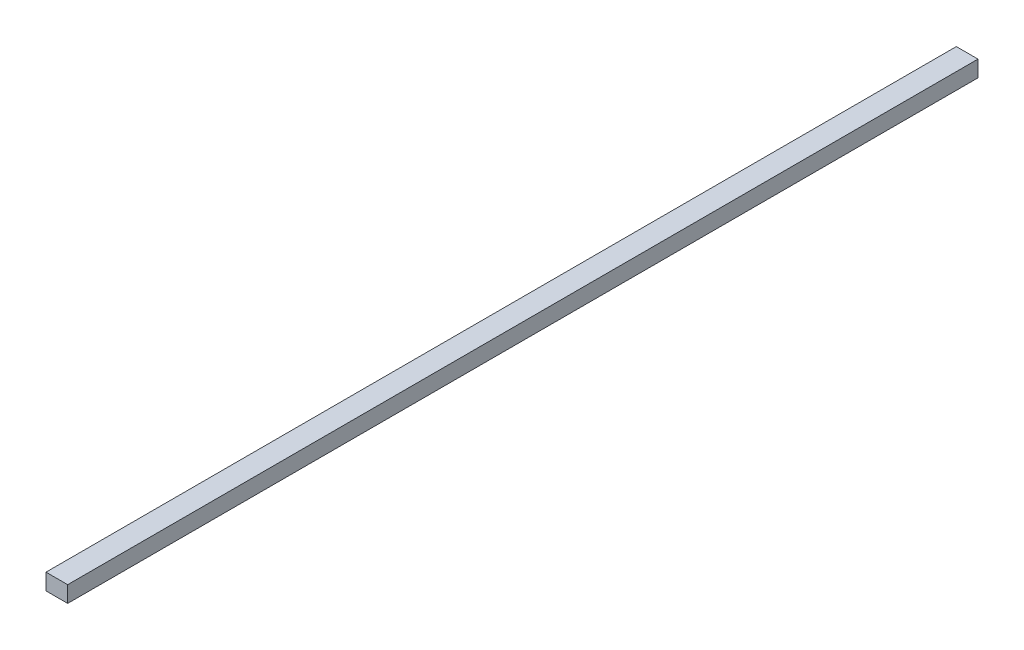
ISO-10303-21;
HEADER;
FILE_DESCRIPTION(('STEP AP214'),'2;1');
FILE_NAME('part.step','',(''),(''),'','','');
FILE_SCHEMA(('AUTOMOTIVE_DESIGN { 1 0 10303 214 1 1 1 1 }'));
ENDSEC;
DATA;
#1=APPLICATION_CONTEXT('core data for automotive mechanical design processes');
#2=APPLICATION_PROTOCOL_DEFINITION('international standard','automotive_design',2000,#1);
#3=PRODUCT_CONTEXT('',#1,'mechanical');
#4=PRODUCT('Part','Part','',(#3));
#5=PRODUCT_RELATED_PRODUCT_CATEGORY('part','',(#4));
#6=PRODUCT_DEFINITION_FORMATION('','',#4);
#7=PRODUCT_DEFINITION_CONTEXT('part definition',#1,'design');
#8=PRODUCT_DEFINITION('design','',#6,#7);
#9=PRODUCT_DEFINITION_SHAPE('','',#8);
#10=(LENGTH_UNIT() NAMED_UNIT(*) SI_UNIT(.MILLI.,.METRE.));
#11=(NAMED_UNIT(*) PLANE_ANGLE_UNIT() SI_UNIT($,.RADIAN.));
#12=(NAMED_UNIT(*) SI_UNIT($,.STERADIAN.) SOLID_ANGLE_UNIT());
#13=UNCERTAINTY_MEASURE_WITH_UNIT(LENGTH_MEASURE(1.E-05),#10,'distance_accuracy_value','');
#14=(GEOMETRIC_REPRESENTATION_CONTEXT(3) GLOBAL_UNCERTAINTY_ASSIGNED_CONTEXT((#13)) GLOBAL_UNIT_ASSIGNED_CONTEXT((#10,
#11,#12)) REPRESENTATION_CONTEXT('',''));
#15=CARTESIAN_POINT('',(0.,0.,0.));
#16=DIRECTION('',(0.,0.,1.));
#17=DIRECTION('',(1.,0.,0.));
#18=AXIS2_PLACEMENT_3D('',#15,#16,#17);
#19=CARTESIAN_POINT('',(12.7,19.05,533.4));
#20=DIRECTION('',(-1.,0.,0.));
#21=DIRECTION('',(0.,0.,1.));
#22=AXIS2_PLACEMENT_3D('',#19,#20,#21);
#23=PLANE('',#22);
#24=DIRECTION('',(0.,0.,-1.));
#25=VECTOR('',#24,1.);
#26=CARTESIAN_POINT('',(12.7,0.,533.4));
#27=LINE('',#26,#25);
#28=CARTESIAN_POINT('',(12.7,0.,533.4));
#29=VERTEX_POINT('',#28);
#30=CARTESIAN_POINT('',(12.7,0.,-533.4));
#31=VERTEX_POINT('',#30);
#32=EDGE_CURVE('E107',#29,#31,#27,.T.);
#33=ORIENTED_EDGE('',*,*,#32,.T.);
#34=DIRECTION('',(0.,-1.,0.));
#35=VECTOR('',#34,1.);
#36=CARTESIAN_POINT('',(12.7,19.05,-533.4));
#37=LINE('',#36,#35);
#38=CARTESIAN_POINT('',(12.7,19.05,-533.4));
#39=VERTEX_POINT('',#38);
#40=EDGE_CURVE('E11',#39,#31,#37,.T.);
#41=ORIENTED_EDGE('',*,*,#40,.F.);
#42=DIRECTION('',(0.,0.,-1.));
#43=VECTOR('',#42,1.);
#44=CARTESIAN_POINT('',(12.7,19.05,533.4));
#45=LINE('',#44,#43);
#46=CARTESIAN_POINT('',(12.7,19.05,533.4));
#47=VERTEX_POINT('',#46);
#48=EDGE_CURVE('E91',#47,#39,#45,.T.);
#49=ORIENTED_EDGE('',*,*,#48,.F.);
#50=DIRECTION('',(0.,-1.,0.));
#51=VECTOR('',#50,1.);
#52=CARTESIAN_POINT('',(12.7,19.05,533.4));
#53=LINE('',#52,#51);
#54=EDGE_CURVE('E103',#47,#29,#53,.T.);
#55=ORIENTED_EDGE('',*,*,#54,.T.);
#56=EDGE_LOOP('',(#33,#41,#49,#55));
#57=FACE_BOUND('',#56,.T.);
#58=ADVANCED_FACE('F39',(#57),#23,.F.);
#59=CARTESIAN_POINT('',(-12.7,19.05,-533.4));
#60=DIRECTION('',(0.,0.,1.));
#61=DIRECTION('',(1.,0.,0.));
#62=AXIS2_PLACEMENT_3D('',#59,#60,#61);
#63=PLANE('',#62);
#64=DIRECTION('',(-1.,0.,0.));
#65=VECTOR('',#64,1.);
#66=CARTESIAN_POINT('',(-12.7,0.,-533.4));
#67=LINE('',#66,#65);
#68=CARTESIAN_POINT('',(-12.7,0.,-533.4));
#69=VERTEX_POINT('',#68);
#70=EDGE_CURVE('E96',#31,#69,#67,.T.);
#71=ORIENTED_EDGE('',*,*,#70,.T.);
#72=DIRECTION('',(0.,-1.,0.));
#73=VECTOR('',#72,1.);
#74=CARTESIAN_POINT('',(-12.7,19.05,-533.4));
#75=LINE('',#74,#73);
#76=CARTESIAN_POINT('',(-12.7,19.05,-533.4));
#77=VERTEX_POINT('',#76);
#78=EDGE_CURVE('E48',#77,#69,#75,.T.);
#79=ORIENTED_EDGE('',*,*,#78,.F.);
#80=DIRECTION('',(-1.,0.,0.));
#81=VECTOR('',#80,1.);
#82=CARTESIAN_POINT('',(-12.7,19.05,-533.4));
#83=LINE('',#82,#81);
#84=EDGE_CURVE('E86',#39,#77,#83,.T.);
#85=ORIENTED_EDGE('',*,*,#84,.F.);
#86=ORIENTED_EDGE('',*,*,#40,.T.);
#87=EDGE_LOOP('',(#71,#79,#85,#86));
#88=FACE_BOUND('',#87,.T.);
#89=ADVANCED_FACE('F95',(#88),#63,.F.);
#90=CARTESIAN_POINT('',(-12.7,19.05,533.4));
#91=DIRECTION('',(1.,0.,0.));
#92=DIRECTION('',(0.,0.,-1.));
#93=AXIS2_PLACEMENT_3D('',#90,#91,#92);
#94=PLANE('',#93);
#95=DIRECTION('',(0.,0.,1.));
#96=VECTOR('',#95,1.);
#97=CARTESIAN_POINT('',(-12.7,0.,533.4));
#98=LINE('',#97,#96);
#99=CARTESIAN_POINT('',(-12.7,0.,533.4));
#100=VERTEX_POINT('',#99);
#101=EDGE_CURVE('E73',#69,#100,#98,.T.);
#102=ORIENTED_EDGE('',*,*,#101,.T.);
#103=DIRECTION('',(0.,-1.,0.));
#104=VECTOR('',#103,1.);
#105=CARTESIAN_POINT('',(-12.7,19.05,533.4));
#106=LINE('',#105,#104);
#107=CARTESIAN_POINT('',(-12.7,19.05,533.4));
#108=VERTEX_POINT('',#107);
#109=EDGE_CURVE('E98',#108,#100,#106,.T.);
#110=ORIENTED_EDGE('',*,*,#109,.F.);
#111=DIRECTION('',(0.,0.,1.));
#112=VECTOR('',#111,1.);
#113=CARTESIAN_POINT('',(-12.7,19.05,533.4));
#114=LINE('',#113,#112);
#115=EDGE_CURVE('E89',#77,#108,#114,.T.);
#116=ORIENTED_EDGE('',*,*,#115,.F.);
#117=ORIENTED_EDGE('',*,*,#78,.T.);
#118=EDGE_LOOP('',(#102,#110,#116,#117));
#119=FACE_BOUND('',#118,.T.);
#120=ADVANCED_FACE('F99',(#119),#94,.F.);
#121=CARTESIAN_POINT('',(-12.7,19.05,533.4));
#122=DIRECTION('',(0.,0.,-1.));
#123=DIRECTION('',(-1.,0.,0.));
#124=AXIS2_PLACEMENT_3D('',#121,#122,#123);
#125=PLANE('',#124);
#126=DIRECTION('',(1.,0.,0.));
#127=VECTOR('',#126,1.);
#128=CARTESIAN_POINT('',(-12.7,0.,533.4));
#129=LINE('',#128,#127);
#130=EDGE_CURVE('E79',#100,#29,#129,.T.);
#131=ORIENTED_EDGE('',*,*,#130,.T.);
#132=ORIENTED_EDGE('',*,*,#54,.F.);
#133=DIRECTION('',(1.,0.,0.));
#134=VECTOR('',#133,1.);
#135=CARTESIAN_POINT('',(-12.7,19.05,533.4));
#136=LINE('',#135,#134);
#137=EDGE_CURVE('E56',#108,#47,#136,.T.);
#138=ORIENTED_EDGE('',*,*,#137,.F.);
#139=ORIENTED_EDGE('',*,*,#109,.T.);
#140=EDGE_LOOP('',(#131,#132,#138,#139));
#141=FACE_BOUND('',#140,.T.);
#142=ADVANCED_FACE('F120',(#141),#125,.F.);
#143=CARTESIAN_POINT('',(0.,19.05,0.));
#144=DIRECTION('',(0.,-1.,0.));
#145=DIRECTION('',(0.,0.,-1.));
#146=AXIS2_PLACEMENT_3D('',#143,#144,#145);
#147=PLANE('',#146);
#148=ORIENTED_EDGE('',*,*,#48,.T.);
#149=ORIENTED_EDGE('',*,*,#84,.T.);
#150=ORIENTED_EDGE('',*,*,#115,.T.);
#151=ORIENTED_EDGE('',*,*,#137,.T.);
#152=EDGE_LOOP('',(#148,#149,#150,#151));
#153=FACE_BOUND('',#152,.T.);
#154=ADVANCED_FACE('F87',(#153),#147,.F.);
#155=CARTESIAN_POINT('',(0.,0.,0.));
#156=DIRECTION('',(0.,-1.,0.));
#157=DIRECTION('',(0.,0.,-1.));
#158=AXIS2_PLACEMENT_3D('',#155,#156,#157);
#159=PLANE('',#158);
#160=ORIENTED_EDGE('',*,*,#32,.F.);
#161=ORIENTED_EDGE('',*,*,#130,.F.);
#162=ORIENTED_EDGE('',*,*,#101,.F.);
#163=ORIENTED_EDGE('',*,*,#70,.F.);
#164=EDGE_LOOP('',(#160,#161,#162,#163));
#165=FACE_BOUND('',#164,.T.);
#166=ADVANCED_FACE('F123',(#165),#159,.T.);
#167=CLOSED_SHELL('',(#58,#89,#120,#142,#154,#166));
#168=MANIFOLD_SOLID_BREP('B2',#167);
#169=ADVANCED_BREP_SHAPE_REPRESENTATION('',(#18,#168),#14);
#170=SHAPE_DEFINITION_REPRESENTATION(#9,#169);
ENDSEC;
END-ISO-10303-21;
